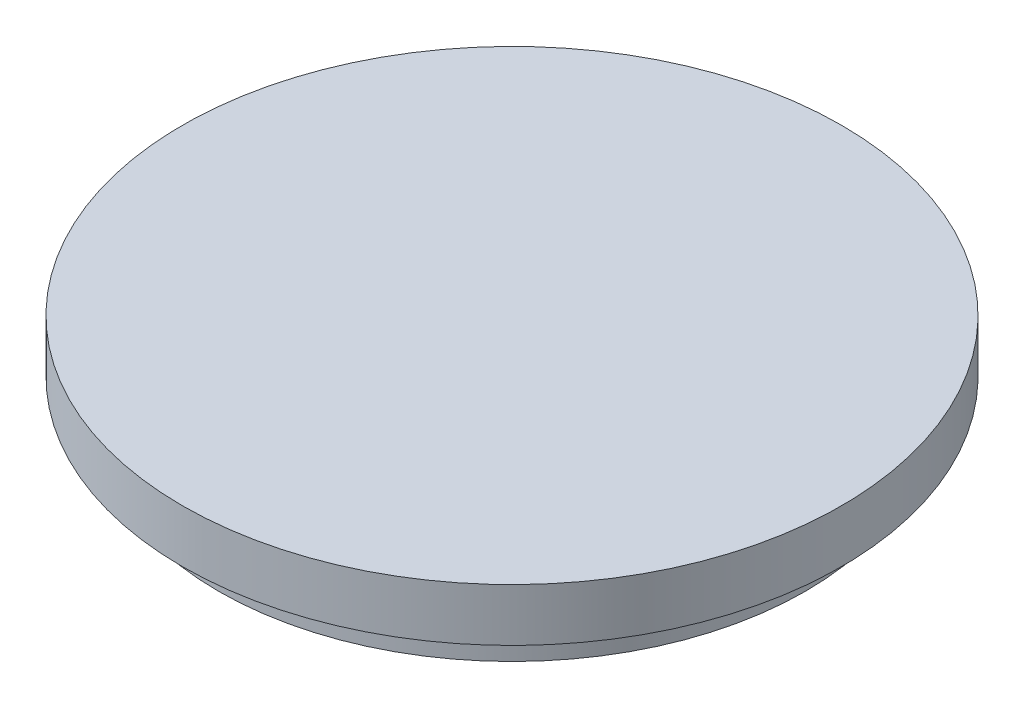
ISO-10303-21;
HEADER;
FILE_DESCRIPTION(('STEP AP214'),'2;1');
FILE_NAME('part.step','',(''),(''),'','','');
FILE_SCHEMA(('AUTOMOTIVE_DESIGN { 1 0 10303 214 1 1 1 1 }'));
ENDSEC;
DATA;
#1=APPLICATION_CONTEXT('core data for automotive mechanical design processes');
#2=APPLICATION_PROTOCOL_DEFINITION('international standard','automotive_design',2000,#1);
#3=PRODUCT_CONTEXT('',#1,'mechanical');
#4=PRODUCT('Part','Part','',(#3));
#5=PRODUCT_RELATED_PRODUCT_CATEGORY('part','',(#4));
#6=PRODUCT_DEFINITION_FORMATION('','',#4);
#7=PRODUCT_DEFINITION_CONTEXT('part definition',#1,'design');
#8=PRODUCT_DEFINITION('design','',#6,#7);
#9=PRODUCT_DEFINITION_SHAPE('','',#8);
#10=(LENGTH_UNIT() NAMED_UNIT(*) SI_UNIT(.MILLI.,.METRE.));
#11=(NAMED_UNIT(*) PLANE_ANGLE_UNIT() SI_UNIT($,.RADIAN.));
#12=(NAMED_UNIT(*) SI_UNIT($,.STERADIAN.) SOLID_ANGLE_UNIT());
#13=UNCERTAINTY_MEASURE_WITH_UNIT(LENGTH_MEASURE(1.E-05),#10,'distance_accuracy_value','');
#14=(GEOMETRIC_REPRESENTATION_CONTEXT(3) GLOBAL_UNCERTAINTY_ASSIGNED_CONTEXT((#13)) GLOBAL_UNIT_ASSIGNED_CONTEXT((#10,
#11,#12)) REPRESENTATION_CONTEXT('',''));
#15=CARTESIAN_POINT('',(0.,0.,0.));
#16=DIRECTION('',(0.,0.,1.));
#17=DIRECTION('',(1.,0.,0.));
#18=AXIS2_PLACEMENT_3D('',#15,#16,#17);
#19=CARTESIAN_POINT('',(0.,4.49384236453202,0.));
#20=DIRECTION('',(0.,1.,0.));
#21=DIRECTION('',(0.,0.,1.));
#22=AXIS2_PLACEMENT_3D('',#19,#20,#21);
#23=PLANE('',#22);
#24=CARTESIAN_POINT('',(0.,4.49384236453202,0.));
#25=DIRECTION('',(0.,1.,0.));
#26=DIRECTION('',(0.,0.,1.));
#27=AXIS2_PLACEMENT_3D('',#24,#25,#26);
#28=CIRCLE('',#27,12.5);
#29=CARTESIAN_POINT('',(0.,4.49384236453202,12.5));
#30=VERTEX_POINT('',#29);
#31=EDGE_CURVE('E10',#30,#30,#28,.T.);
#32=ORIENTED_EDGE('',*,*,#31,.T.);
#33=EDGE_LOOP('',(#32));
#34=FACE_BOUND('',#33,.T.);
#35=ADVANCED_FACE('F37',(#34),#23,.T.);
#36=CARTESIAN_POINT('',(0.,16.9027093596059,0.));
#37=DIRECTION('',(0.,1.,0.));
#38=DIRECTION('',(0.,0.,1.));
#39=AXIS2_PLACEMENT_3D('',#36,#37,#38);
#40=CYLINDRICAL_SURFACE('',#39,12.5);
#41=CARTESIAN_POINT('',(0.,2.49384236453202,0.));
#42=DIRECTION('',(0.,1.,0.));
#43=DIRECTION('',(0.,0.,1.));
#44=AXIS2_PLACEMENT_3D('',#41,#42,#43);
#45=CIRCLE('',#44,12.5);
#46=CARTESIAN_POINT('',(0.,2.49384236453202,12.5));
#47=VERTEX_POINT('',#46);
#48=EDGE_CURVE('E44',#47,#47,#45,.T.);
#49=ORIENTED_EDGE('',*,*,#48,.T.);
#50=EDGE_LOOP('',(#49));
#51=FACE_BOUND('',#50,.T.);
#52=ORIENTED_EDGE('',*,*,#31,.F.);
#53=EDGE_LOOP('',(#52));
#54=FACE_BOUND('',#53,.T.);
#55=ADVANCED_FACE('F73',(#51,#54),#40,.T.);
#56=CARTESIAN_POINT('',(-12.5,2.49384236453202,0.));
#57=DIRECTION('',(0.,-1.,0.));
#58=DIRECTION('',(0.,0.,-1.));
#59=AXIS2_PLACEMENT_3D('',#56,#57,#58);
#60=PLANE('',#59);
#61=CARTESIAN_POINT('',(0.,2.49384236453202,0.));
#62=DIRECTION('',(0.,1.,0.));
#63=DIRECTION('',(0.,0.,1.));
#64=AXIS2_PLACEMENT_3D('',#61,#62,#63);
#65=CIRCLE('',#64,11.125);
#66=CARTESIAN_POINT('',(0.,2.49384236453202,11.125));
#67=VERTEX_POINT('',#66);
#68=EDGE_CURVE('E49',#67,#67,#65,.T.);
#69=ORIENTED_EDGE('',*,*,#68,.T.);
#70=EDGE_LOOP('',(#69));
#71=FACE_BOUND('',#70,.T.);
#72=ORIENTED_EDGE('',*,*,#48,.F.);
#73=EDGE_LOOP('',(#72));
#74=FACE_BOUND('',#73,.T.);
#75=ADVANCED_FACE('F70',(#71,#74),#60,.T.);
#76=CARTESIAN_POINT('',(0.,16.9027093596059,0.));
#77=DIRECTION('',(0.,1.,0.));
#78=DIRECTION('',(0.,0.,1.));
#79=AXIS2_PLACEMENT_3D('',#76,#77,#78);
#80=CYLINDRICAL_SURFACE('',#79,11.125);
#81=CARTESIAN_POINT('',(0.,0.993842364532017,0.));
#82=DIRECTION('',(0.,1.,0.));
#83=DIRECTION('',(0.,0.,1.));
#84=AXIS2_PLACEMENT_3D('',#81,#82,#83);
#85=CIRCLE('',#84,11.125);
#86=CARTESIAN_POINT('',(0.,0.993842364532017,11.125));
#87=VERTEX_POINT('',#86);
#88=EDGE_CURVE('E54',#87,#87,#85,.T.);
#89=ORIENTED_EDGE('',*,*,#88,.T.);
#90=EDGE_LOOP('',(#89));
#91=FACE_BOUND('',#90,.T.);
#92=ORIENTED_EDGE('',*,*,#68,.F.);
#93=EDGE_LOOP('',(#92));
#94=FACE_BOUND('',#93,.T.);
#95=ADVANCED_FACE('F61',(#91,#94),#80,.T.);
#96=CARTESIAN_POINT('',(-11.125,0.993842364532017,0.));
#97=DIRECTION('',(0.,-1.,0.));
#98=DIRECTION('',(0.,0.,-1.));
#99=AXIS2_PLACEMENT_3D('',#96,#97,#98);
#100=PLANE('',#99);
#101=ORIENTED_EDGE('',*,*,#88,.F.);
#102=EDGE_LOOP('',(#101));
#103=FACE_BOUND('',#102,.T.);
#104=ADVANCED_FACE('F64',(#103),#100,.T.);
#105=CLOSED_SHELL('',(#35,#55,#75,#95,#104));
#106=MANIFOLD_SOLID_BREP('B2',#105);
#107=ADVANCED_BREP_SHAPE_REPRESENTATION('',(#18,#106),#14);
#108=SHAPE_DEFINITION_REPRESENTATION(#9,#107);
ENDSEC;
END-ISO-10303-21;
